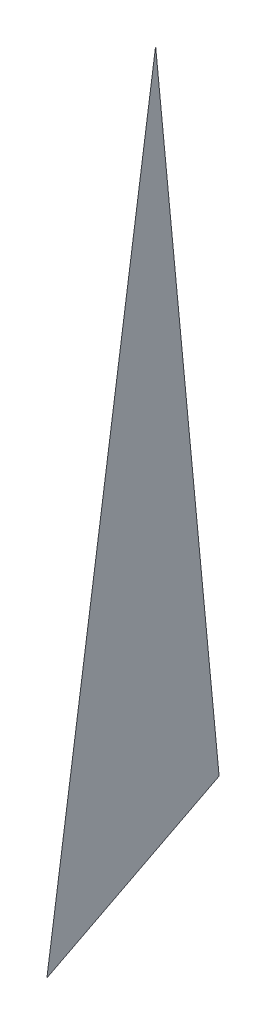
ISO-10303-21;
HEADER;
FILE_DESCRIPTION(('STEP AP214'),'2;1');
FILE_NAME('part.step','',(''),(''),'','','');
FILE_SCHEMA(('AUTOMOTIVE_DESIGN { 1 0 10303 214 1 1 1 1 }'));
ENDSEC;
DATA;
#1=APPLICATION_CONTEXT('core data for automotive mechanical design processes');
#2=APPLICATION_PROTOCOL_DEFINITION('international standard','automotive_design',2000,#1);
#3=PRODUCT_CONTEXT('',#1,'mechanical');
#4=PRODUCT('Part','Part','',(#3));
#5=PRODUCT_RELATED_PRODUCT_CATEGORY('part','',(#4));
#6=PRODUCT_DEFINITION_FORMATION('','',#4);
#7=PRODUCT_DEFINITION_CONTEXT('part definition',#1,'design');
#8=PRODUCT_DEFINITION('design','',#6,#7);
#9=PRODUCT_DEFINITION_SHAPE('','',#8);
#10=(LENGTH_UNIT() NAMED_UNIT(*) SI_UNIT(.MILLI.,.METRE.));
#11=(NAMED_UNIT(*) PLANE_ANGLE_UNIT() SI_UNIT($,.RADIAN.));
#12=(NAMED_UNIT(*) SI_UNIT($,.STERADIAN.) SOLID_ANGLE_UNIT());
#13=UNCERTAINTY_MEASURE_WITH_UNIT(LENGTH_MEASURE(1.E-05),#10,'distance_accuracy_value','');
#14=(GEOMETRIC_REPRESENTATION_CONTEXT(3) GLOBAL_UNCERTAINTY_ASSIGNED_CONTEXT((#13)) GLOBAL_UNIT_ASSIGNED_CONTEXT((#10,
#11,#12)) REPRESENTATION_CONTEXT('',''));
#15=CARTESIAN_POINT('',(0.,0.,0.));
#16=DIRECTION('',(0.,0.,1.));
#17=DIRECTION('',(1.,0.,0.));
#18=AXIS2_PLACEMENT_3D('',#15,#16,#17);
#19=CARTESIAN_POINT('',(-27.1466158792376,8.84636567810782,618.757677373664));
#20=DIRECTION('',(0.16459708377451,0.,0.986360887308964));
#21=DIRECTION('',(0.986360887308964,0.,-0.16459708377451));
#22=AXIS2_PLACEMENT_3D('',#19,#20,#21);
#23=PLANE('',#22);
#24=DIRECTION('',(-0.986032038686076,-0.0258201576297391,0.164542207790449));
#25=VECTOR('',#24,1.);
#26=CARTESIAN_POINT('',(99.0089223211857,27.9567695462313,597.705713577285));
#27=LINE('',#26,#25);
#28=CARTESIAN_POINT('',(55.2733168712684,26.8115124121388,605.004008964695));
#29=VERTEX_POINT('',#28);
#30=CARTESIAN_POINT('',(55.2097941441094,26.8098490109876,605.014609198117));
#31=VERTEX_POINT('',#30);
#32=EDGE_CURVE('E11',#29,#31,#27,.T.);
#33=ORIENTED_EDGE('',*,*,#32,.T.);
#34=DIRECTION('',(0.,1.,0.));
#35=VECTOR('',#34,1.);
#36=CARTESIAN_POINT('',(55.2097941441094,7.69848504121622,605.014609198117));
#37=LINE('',#36,#35);
#38=CARTESIAN_POINT('',(55.2097941441094,27.522957025204,605.014609198117));
#39=VERTEX_POINT('',#38);
#40=EDGE_CURVE('E68',#39,#31,#37,.F.);
#41=ORIENTED_EDGE('',*,*,#40,.F.);
#42=CARTESIAN_POINT('',(55.8093961880415,19.9223841947758,604.914551755525));
#43=CARTESIAN_POINT('',(55.7220229119051,21.2173653298963,604.929132003624));
#44=CARTESIAN_POINT('',(55.6271651228859,22.5118109836834,604.944961215474));
#45=CARTESIAN_POINT('',(55.4224171485633,25.0994809689159,604.979128141511));
#46=CARTESIAN_POINT('',(55.3125269473378,26.3927052990662,604.997465858355));
#47=CARTESIAN_POINT('',(54.9603497984823,30.2688107069637,605.056234745503));
#48=CARTESIAN_POINT('',(54.6954546435605,32.8496333476241,605.100438617095));
#49=CARTESIAN_POINT('',(54.2525178680671,36.7183671382407,605.174352843096));
#50=CARTESIAN_POINT('',(54.0970709692536,38.0089909014725,605.200292746589));
#51=CARTESIAN_POINT('',(53.7709767172403,40.5882732289993,605.254709100286));
#52=CARTESIAN_POINT('',(53.6003293629777,41.8769317931569,605.283185550668));
#53=CARTESIAN_POINT('',(53.2437188874637,44.4528099828997,605.34269424071));
#54=CARTESIAN_POINT('',(53.0577471523356,45.7400283812505,605.373727917796));
#55=CARTESIAN_POINT('',(52.6706782249268,48.3121262777445,605.438319303658));
#56=CARTESIAN_POINT('',(52.4695810267306,49.5970057749728,605.471877013421));
#57=CARTESIAN_POINT('',(52.2609744935417,50.8806309405377,605.506687829078));
#58=B_SPLINE_CURVE_WITH_KNOTS('',3,(#42,#43,#44,#45,#46,#47,#48,#49,#50,#51,#52,#53,#54,#55,#56,
#57),.UNSPECIFIED.,.F.,.F.,(4,2,2,2,2,2,2,4),(0.,3.89396614315098,7.78793641072824,
15.5713400549189,19.4719007714133,23.3724617606358,27.2752304210771,31.1780006078665),.UNSPECIFIED.);
#59=EDGE_CURVE('E38',#29,#39,#58,.T.);
#60=ORIENTED_EDGE('',*,*,#59,.F.);
#61=EDGE_LOOP('',(#33,#41,#60));
#62=FACE_BOUND('',#61,.T.);
#63=ADVANCED_FACE('F35',(#62),#23,.F.);
#64=CARTESIAN_POINT('',(22.3156312445716,25.9484850412162,491.540224750278));
#65=DIRECTION('',(0.0261769483078731,-0.999657324975557,0.));
#66=DIRECTION('',(0.999657324975557,0.0261769483078731,0.));
#67=AXIS2_PLACEMENT_3D('',#64,#65,#66);
#68=PLANE('',#67);
#69=ORIENTED_EDGE('',*,*,#32,.F.);
#70=CARTESIAN_POINT('',(53.0799098836914,26.7540760287928,599.040224750278));
#71=CARTESIAN_POINT('',(53.301432273011,26.7598767967054,599.620807845195));
#72=CARTESIAN_POINT('',(53.5218696409574,26.7656491523333,600.201818099667));
#73=CARTESIAN_POINT('',(53.9600279572643,26.777122731639,601.368348980385));
#74=CARTESIAN_POINT('',(54.1777285217318,26.7828234215457,601.953877257124));
#75=CARTESIAN_POINT('',(54.6083187560114,26.794098823649,603.129238603696));
#76=CARTESIAN_POINT('',(54.8211869597649,26.7996729737371,603.71907957577));
#77=CARTESIAN_POINT('',(55.2396720512231,26.8106313915199,604.902974291953));
#78=CARTESIAN_POINT('',(55.4452697923589,26.8160151578441,605.497034833179));
#79=CARTESIAN_POINT('',(55.8467904985592,26.8265293475651,606.689271284612));
#80=CARTESIAN_POINT('',(56.0427008538905,26.8316594407643,607.287451460918));
#81=CARTESIAN_POINT('',(56.4223884026197,26.8416019091362,608.487843437068));
#82=CARTESIAN_POINT('',(56.6061623831884,26.8464142001778,609.09005625836));
#83=CARTESIAN_POINT('',(56.9547700337194,26.855542812773,610.283819258757));
#84=CARTESIAN_POINT('',(57.119959629002,26.8598684545591,610.875264978103));
#85=CARTESIAN_POINT('',(57.4340789464259,26.8680939583686,612.061800280308));
#86=CARTESIAN_POINT('',(57.5830259811766,26.8719942737385,612.65688525506));
#87=CARTESIAN_POINT('',(57.862564269038,26.87931424142,613.85054302463));
#88=CARTESIAN_POINT('',(57.9931795708637,26.8827345234694,614.449110156498));
#89=CARTESIAN_POINT('',(58.2339878015815,26.8890403089122,615.649576729934));
#90=CARTESIAN_POINT('',(58.344206442287,26.8919264855931,616.251470977404));
#91=CARTESIAN_POINT('',(58.5422645043722,26.8971128184731,617.458393133913));
#92=CARTESIAN_POINT('',(58.630123876839,26.8994134971096,618.063417754298));
#93=CARTESIAN_POINT('',(58.7819649472033,26.9033895954691,619.276365133117));
#94=CARTESIAN_POINT('',(58.8459520643436,26.9050651571,619.884287202025));
#95=CARTESIAN_POINT('',(58.9171710721247,26.906930092452,620.731369463912));
#96=CARTESIAN_POINT('',(58.9352359757978,26.9074031386027,620.969650934525));
#97=CARTESIAN_POINT('',(58.9673558468209,26.9082442270261,621.446541534559));
#98=CARTESIAN_POINT('',(58.9814099162211,26.9086122457852,621.685150725354));
#99=CARTESIAN_POINT('',(59.0054197103026,26.9092409643699,622.162605111543));
#100=CARTESIAN_POINT('',(59.0153749173439,26.9095016506407,622.401450332928));
#101=CARTESIAN_POINT('',(59.031105817276,26.9099135787525,622.87929019663));
#102=CARTESIAN_POINT('',(59.0368813166142,26.9100648155252,623.118284845353));
#103=CARTESIAN_POINT('',(59.0441957747367,26.9102563513519,623.597879578973));
#104=CARTESIAN_POINT('',(59.0457072003305,26.910295929424,623.838480087377));
#105=CARTESIAN_POINT('',(59.0443246355232,26.9102597256904,624.319653752119));
#106=CARTESIAN_POINT('',(59.0414309238587,26.9101839511837,624.560226909224));
#107=CARTESIAN_POINT('',(59.0311317744145,26.9099142584641,625.041255644811));
#108=CARTESIAN_POINT('',(59.0237267468721,26.9097203509937,625.281711231996));
#109=CARTESIAN_POINT('',(59.0043012547142,26.9092116765796,625.762412834771));
#110=CARTESIAN_POINT('',(58.9922812230748,26.9088969209738,626.002658867902));
#111=CARTESIAN_POINT('',(58.9779009779785,26.9085203610036,626.242765751048));
#112=B_SPLINE_CURVE_WITH_KNOTS('',3,(#70,#71,#72,#73,#74,#75,#76,#77,#78,#79,#80,#81,#82,#83,
#84,#85,#86,#87,#88,#89,#90,#91,#92,#93,#94,#95,#96,#97,#98,#99,#100,#101,#102,#103,#104,#105,
#106,#107,#108,#109,#110,#111),.UNSPECIFIED.,.F.,.F.,(4,2,2,2,2,2,2,2,2,2,2,2,2,2,2,2,2,2,2,2,
4),(0.,1.86432516495948,3.73845540405128,5.61971923835367,7.505615546688,9.39390530819073,
11.2826929640422,13.1247857346968,14.9648954593371,16.802568186091,18.6379083427155,
20.4716050446821,22.3048852253418,23.0217571644178,23.7387894718302,24.4559123045539,
25.1730683434497,25.8948445871328,26.6165751620919,27.3382401161688,28.0598373807236),.UNSPECIFIED.);
#113=CARTESIAN_POINT('',(55.3796654026876,26.8142972464414,605.311379479113));
#114=VERTEX_POINT('',#113);
#115=EDGE_CURVE('E64',#29,#114,#112,.T.);
#116=ORIENTED_EDGE('',*,*,#115,.T.);
#117=CARTESIAN_POINT('',(22.315631244571,25.9484850412162,624.040224750278));
#118=DIRECTION('',(0.0261769483078731,-0.999657324975557,0.));
#119=DIRECTION('',(0.999657324975557,0.0261769483078731,0.));
#120=AXIS2_PLACEMENT_3D('',#117,#118,#119);
#121=ELLIPSE('',#120,38.0130261146532,38.0000000000002);
#122=EDGE_CURVE('E67',#114,#31,#121,.F.);
#123=ORIENTED_EDGE('',*,*,#122,.T.);
#124=EDGE_LOOP('',(#69,#116,#123));
#125=FACE_BOUND('',#124,.T.);
#126=ADVANCED_FACE('F66',(#125),#68,.T.);
#127=CARTESIAN_POINT('',(53.3837848339984,57.1984850412162,626.830731993716));
#128=CARTESIAN_POINT('',(54.6111069223229,52.3006879412537,626.701735244197));
#129=CARTESIAN_POINT('',(56.7620887726272,42.4281636903043,626.475657941751));
#130=CARTESIAN_POINT('',(59.8366928592241,22.4528104112107,626.152504030484));
#131=CARTESIAN_POINT('',(60.7628683326226,7.30024252719297,626.055159065631));
#132=CARTESIAN_POINT('',(60.7628683326226,-2.80151495878378,626.055159065631));
#133=CARTESIAN_POINT('',(53.4566113213666,57.1984850412162,626.019917221507));
#134=CARTESIAN_POINT('',(54.6778708967021,52.2998136645397,625.891450491837));
#135=CARTESIAN_POINT('',(56.8193101788641,42.4265024089809,625.666394325508));
#136=CARTESIAN_POINT('',(59.8820281105996,22.4514345728341,625.344560477648));
#137=CARTESIAN_POINT('',(60.8052152614531,7.29984153527047,625.247131528314));
#138=CARTESIAN_POINT('',(60.8052448789266,-2.80151495878378,625.246566393248));
#139=CARTESIAN_POINT('',(53.5399137376127,57.1984850412162,624.393003354437));
#140=CARTESIAN_POINT('',(54.7510218779414,52.2980931815687,624.265958450268));
#141=CARTESIAN_POINT('',(56.8767490729314,42.4232240912138,624.043586791771));
#142=CARTESIAN_POINT('',(59.9203523802121,22.4487037362175,623.725389078516));
#143=CARTESIAN_POINT('',(60.8388489886736,7.29903970063427,623.628232293561));
#144=CARTESIAN_POINT('',(60.8388604518431,-2.80151495878378,623.626697495409));
#145=CARTESIAN_POINT('',(53.5228659736349,57.1984850412162,621.135697469723));
#146=CARTESIAN_POINT('',(54.7105842917434,52.2947643069982,621.012247220513));
#147=CARTESIAN_POINT('',(56.7991804563111,42.4168463485516,620.796571608203));
#148=CARTESIAN_POINT('',(59.7958210719922,22.4433318012794,620.487744190038));
#149=CARTESIAN_POINT('',(60.7019569863221,7.29744122519937,620.392148528554));
#150=CARTESIAN_POINT('',(60.7017124051041,-2.80151495878377,620.389118634045));
#151=CARTESIAN_POINT('',(53.2266477784214,57.1984850412162,617.072923360646));
#152=CARTESIAN_POINT('',(54.3692611199742,52.2908116502482,616.957474119014));
#153=CARTESIAN_POINT('',(56.3831331727495,42.4092097375221,616.756181646546));
#154=CARTESIAN_POINT('',(59.2796344693361,22.4367922780643,616.467347002705));
#155=CARTESIAN_POINT('',(60.1573399403586,7.29545873323247,616.375823823184));
#156=CARTESIAN_POINT('',(60.1564934929376,-2.80151495878377,616.370546797682));
#157=CARTESIAN_POINT('',(52.5474780561626,57.1984850412162,612.233781622715));
#158=CARTESIAN_POINT('',(53.6066779532526,52.2865347946107,612.140861384593));
#159=CARTESIAN_POINT('',(55.478634928553,42.4009291342485,611.978780543744));
#160=CARTESIAN_POINT('',(58.1780446154998,22.429732668458,611.7426248451));
#161=CARTESIAN_POINT('',(58.9964931914277,7.29340024234292,611.66057665133));
#162=CARTESIAN_POINT('',(58.9931276656764,-2.80151495878376,611.648175300846));
#163=CARTESIAN_POINT('',(51.607378162443,57.1984850412162,607.438995574493));
#164=CARTESIAN_POINT('',(52.5665156676035,52.2829179215302,607.381365911078));
#165=CARTESIAN_POINT('',(54.2664100525556,42.3940303231525,607.280301151988));
#166=CARTESIAN_POINT('',(56.7231649008552,22.4241809185275,607.125935428547));
#167=CARTESIAN_POINT('',(57.4662122830725,7.29207941861767,607.059065127475));
#168=CARTESIAN_POINT('',(57.4580434289068,-2.80151495878375,607.036206380347));
#169=CARTESIAN_POINT('',(50.4555760589199,57.1984850412162,602.692019476847));
#170=CARTESIAN_POINT('',(51.3128147388859,52.2799893211882,602.674932329693));
#171=CARTESIAN_POINT('',(52.8367621621873,42.3885983666706,602.644164198583));
#172=CARTESIAN_POINT('',(55.0442552946973,22.4202783100057,602.585611204211));
#173=CARTESIAN_POINT('',(55.709624013101,7.29158270992662,602.539499286397));
#174=CARTESIAN_POINT('',(55.6967604111916,-2.80151495878374,602.507740534983));
#175=CARTESIAN_POINT('',(49.1358306845534,57.1984850412162,597.987924360303));
#176=CARTESIAN_POINT('',(49.9019901548875,52.2775280966282,598.007599511115));
#177=CARTESIAN_POINT('',(51.2687016131177,42.384095359392,598.041239032998));
#178=CARTESIAN_POINT('',(53.254527585413,22.4172939696391,598.073739783396));
#179=CARTESIAN_POINT('',(53.853144015813,7.29149818986182,598.052871720605));
#180=CARTESIAN_POINT('',(53.8389354033009,-2.80151495878373,598.018811305949));
#181=CARTESIAN_POINT('',(47.6919009783035,57.1984850412162,593.321781255393));
#182=CARTESIAN_POINT('',(48.3872495318695,52.2751574151172,593.367351665107));
#183=CARTESIAN_POINT('',(49.6321271672309,42.3795935564637,593.447320337311));
#184=CARTESIAN_POINT('',(51.4483156062675,22.4139512489552,593.549651358449));
#185=CARTESIAN_POINT('',(51.9992825429624,7.29110206046158,593.555057459052));
#186=CARTESIAN_POINT('',(51.9879892367671,-2.80151495878372,593.526939871846));
#187=CARTESIAN_POINT('',(46.1688631082807,57.1984850412162,588.680461061797));
#188=CARTESIAN_POINT('',(46.8192343280364,52.2725403145012,588.73862449042));
#189=CARTESIAN_POINT('',(47.9873048301986,42.3742648894822,588.842484938362));
#190=CARTESIAN_POINT('',(49.6989879430315,22.4091130465107,588.986729242457));
#191=CARTESIAN_POINT('',(50.2242360235055,7.28975026492382,589.016686255887));
#192=CARTESIAN_POINT('',(50.2188635559705,-2.80151495878371,589.001924704993));
#193=CARTESIAN_POINT('',(44.6117932425952,57.1984850412162,584.050834679198));
#194=CARTESIAN_POINT('',(45.2448045370905,52.2695232528267,584.109438335101));
#195=CARTESIAN_POINT('',(46.3839589414187,42.3677398405452,584.216359407877));
#196=CARTESIAN_POINT('',(48.0590620205909,22.4022842315643,584.375019872538));
#197=CARTESIAN_POINT('',(48.5792298771047,7.28716558684748,584.424967110118));
#198=CARTESIAN_POINT('',(48.5803878848585,-2.8015149587837,584.427679197103));
#199=CARTESIAN_POINT('',(42.5551033486819,57.1984850412162,577.871539242335));
#200=CARTESIAN_POINT('',(43.1982805058001,52.2650584697842,577.919314483684));
#201=CARTESIAN_POINT('',(44.3563569083928,42.357691833497,578.0103923016));
#202=CARTESIAN_POINT('',(46.062909230916,22.3909007151939,578.160380273631));
#203=CARTESIAN_POINT('',(46.5986637821419,7.28229782390192,578.229663208013));
#204=CARTESIAN_POINT('',(46.6070200655929,-2.80151495878369,578.256862296609));
#205=CARTESIAN_POINT('',(40.6246872270962,57.1984850412162,571.649475403289));
#206=CARTESIAN_POINT('',(41.3173905812015,52.2604097750897,571.678336869243));
#207=CARTESIAN_POINT('',(42.5618940404169,42.3468484366235,571.738799032555));
#208=CARTESIAN_POINT('',(44.3925904432305,22.3778610748263,571.856610341272));
#209=CARTESIAN_POINT('',(44.9675781529571,7.27631578683062,571.934606474602));
#210=CARTESIAN_POINT('',(44.979030232712,-2.80151495878368,571.982351392297));
#211=CARTESIAN_POINT('',(39.0247433573873,57.1984850412162,565.334867165084));
#212=CARTESIAN_POINT('',(39.7754881060632,52.2564321301552,565.350143716919));
#213=CARTESIAN_POINT('',(41.1201975688653,42.3374044013755,565.388397959515));
#214=CARTESIAN_POINT('',(43.0916477789871,22.3663267397793,565.48220790016));
#215=CARTESIAN_POINT('',(43.7074022297431,7.27104886847697,565.565495702725));
#216=CARTESIAN_POINT('',(43.7185222382092,-2.80151495878367,565.627274758135));
#217=CARTESIAN_POINT('',(38.0402074931327,57.1984850412162,560.549091845363));
#218=CARTESIAN_POINT('',(38.8309646506533,52.2538328731227,560.558214546946));
#219=CARTESIAN_POINT('',(40.2442111372913,42.3311565222033,560.586502176643));
#220=CARTESIAN_POINT('',(42.3105773554394,22.3586404885077,560.670326375639));
#221=CARTESIAN_POINT('',(42.9524408877316,7.26758301015222,560.757633515248));
#222=CARTESIAN_POINT('',(42.9620724895071,-2.80151495878366,560.827327228364));
#223=CARTESIAN_POINT('',(37.3174012520546,57.1984850412162,555.716279797676));
#224=CARTESIAN_POINT('',(38.1382560975987,52.2515971725347,555.723807500605));
#225=CARTESIAN_POINT('',(39.6023010807567,42.3257070767183,555.749764489807));
#226=CARTESIAN_POINT('',(41.737253954654,22.3518895325641,555.833084080363));
#227=CARTESIAN_POINT('',(42.3962986815463,7.26459050932727,555.925068975458));
#228=CARTESIAN_POINT('',(42.4034422050429,-2.80151495878365,556.000250211637));
#229=CARTESIAN_POINT('',(36.8951898110703,57.1984850412162,550.847502094629));
#230=CARTESIAN_POINT('',(37.7316563136829,52.2496367655347,550.857224911572));
#231=CARTESIAN_POINT('',(39.2208325839335,42.3208497447576,550.887181372913));
#232=CARTESIAN_POINT('',(41.3869187657585,22.3458072180421,550.977770351306));
#233=CARTESIAN_POINT('',(42.0511145807206,7.26192470779267,551.074818040623));
#234=CARTESIAN_POINT('',(42.0550021363446,-2.80151495878364,551.153322012489));
#235=CARTESIAN_POINT('',(36.8011060819809,57.1984850412162,545.961025608695));
#236=CARTESIAN_POINT('',(37.6365845742963,52.2478600464297,545.975072066142));
#237=CARTESIAN_POINT('',(39.1215936083429,42.3163698490701,546.012472133045));
#238=CARTESIAN_POINT('',(41.2763585743944,22.3401151911117,546.114059419963));
#239=CARTESIAN_POINT('',(41.9323843596282,7.25943226166797,546.21545319628));
#240=CARTESIAN_POINT('',(41.9324513535887,-2.80151495878363,546.295236369654));
#241=CARTESIAN_POINT('',(37.0483022012983,57.1984850412162,541.079796444916));
#242=CARTESIAN_POINT('',(37.8668219100682,52.2462038143447,541.098164649665));
#243=CARTESIAN_POINT('',(39.3195367061893,42.3121237244504,541.142760063545));
#244=CARTESIAN_POINT('',(41.4224015253268,22.3346345148076,541.253941695414));
#245=CARTESIAN_POINT('',(42.0577327128435,7.25701663670997,541.357637893107));
#246=CARTESIAN_POINT('',(42.0536451033126,-2.80151495878363,541.436890353852));
#247=CARTESIAN_POINT('',(37.6346532539282,57.1984850412162,536.227746563298));
#248=CARTESIAN_POINT('',(38.4234433542189,52.2446410764232,536.248478560384));
#249=CARTESIAN_POINT('',(39.8214073084123,42.3080582257364,536.296662253912));
#250=CARTESIAN_POINT('',(41.8400934653431,22.3293129802239,536.411508019066));
#251=CARTESIAN_POINT('',(42.4449261093013,7.25465371470943,536.514522894544));
#252=CARTESIAN_POINT('',(42.4365766568056,-2.80151495878362,536.591896003666));
#253=CARTESIAN_POINT('',(38.5441093664349,57.1984850412162,531.426072466011));
#254=CARTESIAN_POINT('',(39.2955087660307,52.2431624335867,531.446071640422));
#255=CARTESIAN_POINT('',(40.6252696270982,42.3041641922123,531.492332121376));
#256=CARTESIAN_POINT('',(42.5405244776615,22.3241599566807,531.602572649433));
#257=CARTESIAN_POINT('',(43.1091340840842,7.25235456501452,531.701810810087));
#258=CARTESIAN_POINT('',(43.0965770105401,-2.80151495878361,531.776608650539));
#259=CARTESIAN_POINT('',(39.7499532326201,57.1984850412162,526.690576835428));
#260=CARTESIAN_POINT('',(40.4622155276842,52.2417509781372,526.706846944234));
#261=CARTESIAN_POINT('',(41.7207240853318,42.3004136916169,526.745926890275));
#262=CARTESIAN_POINT('',(43.5282733398122,22.3191585333338,526.843992963736));
#263=CARTESIAN_POINT('',(44.0595287245741,7.25011523973708,526.937089238929));
#264=CARTESIAN_POINT('',(44.0428998388363,-2.8015149587836,527.009190923968));
#265=CARTESIAN_POINT('',(41.2185986519397,57.1984850412162,522.030201972256));
#266=CARTESIAN_POINT('',(41.8954551893649,52.2403696343187,522.041134564034));
#267=CARTESIAN_POINT('',(43.0892998278865,42.2967283715372,522.070240448368));
#268=CARTESIAN_POINT('',(44.7987503743062,22.3142212111266,522.152221401206));
#269=CARTESIAN_POINT('',(45.2957787110192,7.24789145486722,522.238116181884));
#270=CARTESIAN_POINT('',(45.2752889654331,-2.80151495878359,522.307628988438));
#271=CARTESIAN_POINT('',(42.9129170161401,57.1984850412162,517.448390554412));
#272=CARTESIAN_POINT('',(43.5620492917042,52.2389692446547,517.454485684083));
#273=CARTESIAN_POINT('',(44.7048115318221,42.2929996752646,517.474465150787));
#274=CARTESIAN_POINT('',(46.3360055017468,22.309218204989,517.541407401709));
#275=CARTESIAN_POINT('',(46.8053062260034,7.24561476295897,517.620132295787));
#276=CARTESIAN_POINT('',(46.7814724769629,-2.80151495878358,517.686720659348));
#277=CARTESIAN_POINT('',(44.7945588289503,57.1984850412162,512.939219824628));
#278=CARTESIAN_POINT('',(45.4256048407413,52.2375065523197,512.943474942614));
#279=CARTESIAN_POINT('',(46.5343773514988,42.2891337977158,512.959519098259));
#280=CARTESIAN_POINT('',(48.1124493639867,22.3040403821259,513.018528787183));
#281=CARTESIAN_POINT('',(48.5624609790078,7.24322851786632,513.091693906797));
#282=CARTESIAN_POINT('',(48.5361611341362,-2.80151495878357,513.154753306215));
#283=CARTESIAN_POINT('',(46.8251745940992,57.1984850412162,508.496767025641));
#284=CARTESIAN_POINT('',(47.447502309981,52.2359628609532,508.503491483328));
#285=CARTESIAN_POINT('',(48.5390410623186,42.2850983349698,508.522972476841));
#286=CARTESIAN_POINT('',(50.0891434056556,22.2986645713697,508.583724900367));
#287=CARTESIAN_POINT('',(50.5290108524966,7.24072519437322,508.652839498675));
#288=CARTESIAN_POINT('',(50.5018725547416,-2.80151495878357,508.710794018558));
#289=CARTESIAN_POINT('',(48.9652201413742,57.1984850412162,504.105398692196));
#290=CARTESIAN_POINT('',(49.586599857116,52.2343412971042,504.119536179172));
#291=CARTESIAN_POINT('',(50.6749483876401,42.2809154403804,504.150948717674));
#292=CARTESIAN_POINT('',(52.218617736913,22.2931439817374,504.224757926217));
#293=CARTESIAN_POINT('',(52.6567253964332,7.23814091308343,504.291867481403));
#294=CARTESIAN_POINT('',(52.6307071203984,-2.80151495878356,504.343187817512));
#295=CARTESIAN_POINT('',(51.1751513005624,57.1984850412162,499.749481359042));
#296=CARTESIAN_POINT('',(51.8003810529004,52.2326606104107,499.77485048116));
#297=CARTESIAN_POINT('',(52.8944405764976,42.2766463250247,499.824724978076));
#298=CARTESIAN_POINT('',(54.4460153647911,22.2875865030586,499.920098040001));
#299=CARTESIAN_POINT('',(54.8887368752675,7.23554304077932,499.986393917265));
#300=CARTESIAN_POINT('',(54.865933045272,-2.80151495878355,500.029534468471));
#301=CARTESIAN_POINT('',(53.4106992881611,57.1984850412162,495.406628747989));
#302=CARTESIAN_POINT('',(54.0412844808135,52.2309340220667,495.445114969748));
#303=CARTESIAN_POINT('',(55.1441766040228,42.2723383788656,495.516679968185));
#304=CARTESIAN_POINT('',(56.7095362945289,22.282080675603,495.637755971034));
#305=CARTESIAN_POINT('',(57.1603045817722,7.23298788735192,495.703658097315));
#306=CARTESIAN_POINT('',(57.1423325146103,-2.80151495878354,495.737669159317));
#307=CARTESIAN_POINT('',(55.6201663388002,57.1984850412162,491.050370874932));
#308=CARTESIAN_POINT('',(56.2540106497408,52.2291591121407,491.101266268284));
#309=CARTESIAN_POINT('',(57.3624933448757,42.2679998890573,491.193300666125));
#310=CARTESIAN_POINT('',(58.9380270174382,22.2766602957085,491.338246076751));
#311=CARTESIAN_POINT('',(59.3967144527915,7.23050048044542,491.402976734493));
#312=CARTESIAN_POINT('',(59.3843694488823,-2.80151495878353,491.427565817295));
#313=CARTESIAN_POINT('',(57.7374333886097,57.1984850412162,486.648104988096));
#314=CARTESIAN_POINT('',(58.3689365333483,52.2273144916167,486.708312641085));
#315=CARTESIAN_POINT('',(59.4735559079587,42.263591720039,486.815501610026));
#316=CARTESIAN_POINT('',(61.0462907696021,22.2712927679114,486.977010519658));
#317=CARTESIAN_POINT('',(61.5091086458901,7.22806790953182,487.038731488486));
#318=CARTESIAN_POINT('',(61.5022094590466,-2.80151495878352,487.054248947684));
#319=CARTESIAN_POINT('',(59.348201770278,57.1984850412162,482.908113427546));
#320=CARTESIAN_POINT('',(59.9709760584331,52.2256935779152,482.972677594682));
#321=CARTESIAN_POINT('',(61.0607525401696,42.2598080329178,483.086669407786));
#322=CARTESIAN_POINT('',(62.6146589676281,22.2668093610598,483.254076623517));
#323=CARTESIAN_POINT('',(63.0754579547611,7.22606007782047,483.311486223478));
#324=CARTESIAN_POINT('',(63.0722570020916,-2.80151495878351,483.320037352557));
#325=CARTESIAN_POINT('',(60.4722825628936,57.1984850412162,479.85117100871));
#326=CARTESIAN_POINT('',(61.0850468784891,52.2243340555737,479.918164624828));
#327=CARTESIAN_POINT('',(62.1577778380951,42.2566907403932,480.03584473203));
#328=CARTESIAN_POINT('',(63.6891611285076,22.2631935514373,480.205774796914));
#329=CARTESIAN_POINT('',(64.1455397393771,7.22445522579038,480.259504957554));
#330=CARTESIAN_POINT('',(64.1444899857721,-2.80151495878351,480.262934833143));
#331=CARTESIAN_POINT('',(60.9618316986286,57.1984850412162,478.297746117383));
#332=CARTESIAN_POINT('',(61.5694539042326,52.2236320004357,478.365993555433));
#333=CARTESIAN_POINT('',(62.6334617171231,42.2550997658362,478.485625936795));
#334=CARTESIAN_POINT('',(64.1532518357926,22.2613747018127,478.657112249562));
#335=CARTESIAN_POINT('',(64.6070915976871,7.22365303283337,478.709291413042));
#336=CARTESIAN_POINT('',(64.6068012825531,-2.8015149587835,478.710374883872));
#337=CARTESIAN_POINT('',(61.1830357823081,57.1984850412162,477.514296863831));
#338=CARTESIAN_POINT('',(61.7884419469006,52.2232751112862,477.583274183464));
#339=CARTESIAN_POINT('',(62.8487189385081,42.2542957749495,477.70407748747));
#340=CARTESIAN_POINT('',(64.3635977524706,22.2604624130304,477.876676126643));
#341=CARTESIAN_POINT('',(64.8163676012906,7.22325204068177,477.928262734789));
#342=CARTESIAN_POINT('',(64.8163676012906,-2.8015149587835,477.928262734789));
#343=CARTESIAN_POINT('',(61.324606395863,57.1984850412162,477.012889341558));
#344=CARTESIAN_POINT('',(61.9285942942081,52.2230467022305,477.082333785403));
#345=CARTESIAN_POINT('',(62.9864835601945,42.253781220782,477.203886479902));
#346=CARTESIAN_POINT('',(64.4982191391445,22.2598785482097,477.377197007974));
#347=CARTESIAN_POINT('',(64.9503042435968,7.22299540570475,477.428404380707));
#348=CARTESIAN_POINT('',(64.9504900452826,-2.8015149587835,477.427710959375));
#349=CARTESIAN_POINT('',(61.4661770094179,57.1984850412162,476.511481819284));
#350=CARTESIAN_POINT('',(62.0687466415156,52.2228182931748,476.581393387343));
#351=CARTESIAN_POINT('',(63.1242481818809,42.2532666666144,476.703695472335));
#352=CARTESIAN_POINT('',(64.6328405258184,22.259294683389,476.877717889306));
#353=CARTESIAN_POINT('',(65.0842408859031,7.22273877072772,476.928546026625));
#354=CARTESIAN_POINT('',(65.0846124892746,-2.8015149587835,476.927159183962));
#355=CARTESIAN_POINT('',(61.6077476229727,57.1984850412162,476.010074297011));
#356=CARTESIAN_POINT('',(62.2088989888232,52.2225898841192,476.080452989283));
#357=CARTESIAN_POINT('',(63.2620128035673,42.2527521124469,476.203504464767));
#358=CARTESIAN_POINT('',(64.7674619124924,22.2587108185684,476.378238770638));
#359=CARTESIAN_POINT('',(65.2181775282093,7.2224821357507,476.428687672543));
#360=CARTESIAN_POINT('',(65.2187349332666,-2.8015149587835,476.426607408548));
#361=B_SPLINE_SURFACE_WITH_KNOTS('',3,3,((#127,#128,#129,#130,#131,#132),(#133,#134,#135,#136,
#137,#138),(#139,#140,#141,#142,#143,#144),(#145,#146,#147,#148,#149,#150),(#151,#152,#153,#154,
#155,#156),(#157,#158,#159,#160,#161,#162),(#163,#164,#165,#166,#167,#168),(#169,#170,#171,#172,
#173,#174),(#175,#176,#177,#178,#179,#180),(#181,#182,#183,#184,#185,#186),(#187,#188,#189,#190,
#191,#192),(#193,#194,#195,#196,#197,#198),(#199,#200,#201,#202,#203,#204),(#205,#206,#207,#208,
#209,#210),(#211,#212,#213,#214,#215,#216),(#217,#218,#219,#220,#221,#222),(#223,#224,#225,#226,
#227,#228),(#229,#230,#231,#232,#233,#234),(#235,#236,#237,#238,#239,#240),(#241,#242,#243,#244,
#245,#246),(#247,#248,#249,#250,#251,#252),(#253,#254,#255,#256,#257,#258),(#259,#260,#261,#262,
#263,#264),(#265,#266,#267,#268,#269,#270),(#271,#272,#273,#274,#275,#276),(#277,#278,#279,#280,
#281,#282),(#283,#284,#285,#286,#287,#288),(#289,#290,#291,#292,#293,#294),(#295,#296,#297,#298,
#299,#300),(#301,#302,#303,#304,#305,#306),(#307,#308,#309,#310,#311,#312),(#313,#314,#315,#316,
#317,#318),(#319,#320,#321,#322,#323,#324),(#325,#326,#327,#328,#329,#330),(#331,#332,#333,#334,
#335,#336),(#337,#338,#339,#340,#341,#342),(#343,#344,#345,#346,#347,#348),(#349,#350,#351,#352,
#353,#354),(#355,#356,#357,#358,#359,#360)),.UNSPECIFIED.,.F.,.F.,.F.,(4,1,1,1,1,1,1,1,1,1,1,1,
1,1,1,1,1,1,1,1,1,1,1,1,1,1,1,1,1,1,1,1,1,3,4),(4,1,1,4),(0.,0.015625,0.03125,0.0625,0.09375,
0.125,0.15625,0.1875,0.21875,0.25,0.28125,0.3125,0.375,0.40625,0.4375,0.46875,0.5,0.53125,
0.5625,0.59375,0.625,0.65625,0.6875,0.71875,0.75,0.78125,0.8125,0.84375,0.875,0.90625,0.9375,
0.96875,0.984375,1.,1.01),(0.,0.25,0.5,1.),.UNSPECIFIED.);
#362=CARTESIAN_POINT('',(57.8655588491324,17.6984850412162,610.61626679033));
#363=CARTESIAN_POINT('',(57.785230000254,17.9408304413216,610.403589100126));
#364=CARTESIAN_POINT('',(57.7052143995591,18.1888435282256,610.197411508138));
#365=CARTESIAN_POINT('',(57.5463608377945,18.693146785168,609.797963224999));
#366=CARTESIAN_POINT('',(57.4675188657071,18.9493855436984,609.604629353529));
#367=CARTESIAN_POINT('',(57.3109525386107,19.4688786424892,609.229126615581));
#368=CARTESIAN_POINT('',(57.2332254104168,19.7321078503162,609.046923933536));
#369=CARTESIAN_POINT('',(57.0787959304006,20.2646300094178,608.692269068638));
#370=CARTESIAN_POINT('',(57.0020920274221,20.5339115816042,608.519800430787));
#371=CARTESIAN_POINT('',(56.849625218863,21.0777303858952,608.183449652771));
#372=CARTESIAN_POINT('',(56.7738616421425,21.3522634661956,608.019561083598));
#373=CARTESIAN_POINT('',(56.6231943274914,21.9059166357824,607.699404412056));
#374=CARTESIAN_POINT('',(56.5482904967299,22.1850362217757,607.543135480926));
#375=CARTESIAN_POINT('',(56.3994582172283,22.7465848831092,607.237798857149));
#376=CARTESIAN_POINT('',(56.3255279663209,23.0290051934172,607.088715887368));
#377=CARTESIAN_POINT('',(56.1783335214913,23.5975437946133,606.796554052382));
#378=CARTESIAN_POINT('',(56.1050702171527,23.8836660583861,606.653482484867));
#379=CARTESIAN_POINT('',(55.9591194140646,24.4592963345217,606.372718526864));
#380=CARTESIAN_POINT('',(55.8864330718164,24.7488091751581,606.235035451336));
#381=CARTESIAN_POINT('',(55.7415582956527,25.330958018752,605.964523317902));
#382=CARTESIAN_POINT('',(55.6693711570027,25.6235991316123,605.831704578367));
#383=CARTESIAN_POINT('',(55.5254257142536,26.2117765296424,605.570469461672));
#384=CARTESIAN_POINT('',(55.4536687567008,26.5073178812188,605.442063769677));
#385=CARTESIAN_POINT('',(55.3105232422564,27.1011099886651,605.189278475794));
#386=CARTESIAN_POINT('',(55.2391360284489,27.3993656256451,605.064909571761));
#387=CARTESIAN_POINT('',(55.1679970659746,27.6984850412162,604.942526984927));
#388=B_SPLINE_CURVE_WITH_KNOTS('',3,(#362,#363,#364,#365,#366,#367,#368,#369,#370,#371,#372,
#373,#374,#375,#376,#377,#378,#379,#380,#381,#382,#383,#384,#385,#386,#387),.UNSPECIFIED.,.F.,
.F.,(4,2,2,2,2,2,2,2,2,2,2,2,4),(0.,0.996605724708248,1.98787684104066,2.97596917002555,
3.96233779918535,4.94795644592022,5.93346765017521,6.91678184886957,7.90125717243602,
8.88736525802801,9.87545643135809,10.8657920326766,11.8585673917346),.UNSPECIFIED.);
#389=EDGE_CURVE('E69',#114,#39,#388,.T.);
#390=ORIENTED_EDGE('',*,*,#115,.F.);
#391=ORIENTED_EDGE('',*,*,#59,.T.);
#392=ORIENTED_EDGE('',*,*,#389,.F.);
#393=EDGE_LOOP('',(#390,#391,#392));
#394=FACE_BOUND('',#393,.T.);
#395=ADVANCED_FACE('F75',(#394),#361,.F.);
#396=CARTESIAN_POINT('',(22.3156312445708,7.69848504121622,624.040224750278));
#397=DIRECTION('',(0.,1.,0.));
#398=DIRECTION('',(0.,0.,1.));
#399=AXIS2_PLACEMENT_3D('',#396,#397,#398);
#400=CYLINDRICAL_SURFACE('',#399,38.);
#401=ORIENTED_EDGE('',*,*,#389,.T.);
#402=ORIENTED_EDGE('',*,*,#40,.T.);
#403=ORIENTED_EDGE('',*,*,#122,.F.);
#404=EDGE_LOOP('',(#401,#402,#403));
#405=FACE_BOUND('',#404,.T.);
#406=ADVANCED_FACE('F73',(#405),#400,.F.);
#407=CLOSED_SHELL('',(#63,#126,#395,#406));
#408=MANIFOLD_SOLID_BREP('B2',#407);
#409=ADVANCED_BREP_SHAPE_REPRESENTATION('',(#18,#408),#14);
#410=SHAPE_DEFINITION_REPRESENTATION(#9,#409);
ENDSEC;
END-ISO-10303-21;
